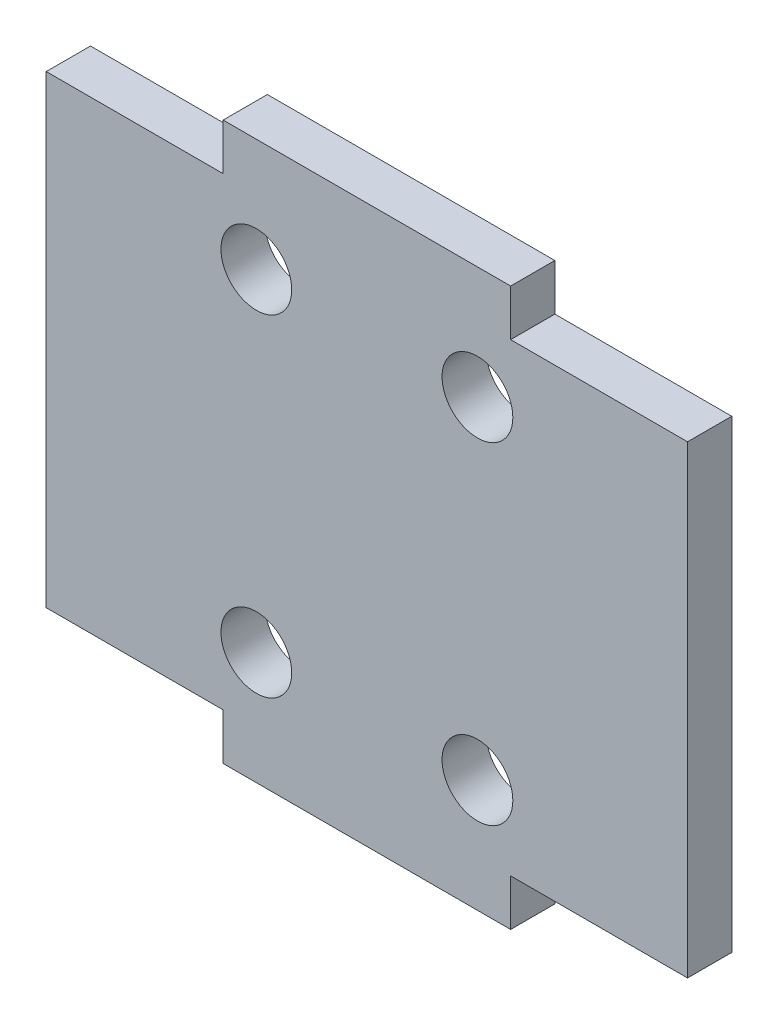
ISO-10303-21;
HEADER;
FILE_DESCRIPTION(('STEP AP214'),'2;1');
FILE_NAME('part.step','',(''),(''),'','','');
FILE_SCHEMA(('AUTOMOTIVE_DESIGN { 1 0 10303 214 1 1 1 1 }'));
ENDSEC;
DATA;
#1=APPLICATION_CONTEXT('core data for automotive mechanical design processes');
#2=APPLICATION_PROTOCOL_DEFINITION('international standard','automotive_design',2000,#1);
#3=PRODUCT_CONTEXT('',#1,'mechanical');
#4=PRODUCT('Part','Part','',(#3));
#5=PRODUCT_RELATED_PRODUCT_CATEGORY('part','',(#4));
#6=PRODUCT_DEFINITION_FORMATION('','',#4);
#7=PRODUCT_DEFINITION_CONTEXT('part definition',#1,'design');
#8=PRODUCT_DEFINITION('design','',#6,#7);
#9=PRODUCT_DEFINITION_SHAPE('','',#8);
#10=(LENGTH_UNIT() NAMED_UNIT(*) SI_UNIT(.MILLI.,.METRE.));
#11=(NAMED_UNIT(*) PLANE_ANGLE_UNIT() SI_UNIT($,.RADIAN.));
#12=(NAMED_UNIT(*) SI_UNIT($,.STERADIAN.) SOLID_ANGLE_UNIT());
#13=UNCERTAINTY_MEASURE_WITH_UNIT(LENGTH_MEASURE(1.E-05),#10,'distance_accuracy_value','');
#14=(GEOMETRIC_REPRESENTATION_CONTEXT(3) GLOBAL_UNCERTAINTY_ASSIGNED_CONTEXT((#13)) GLOBAL_UNIT_ASSIGNED_CONTEXT((#10,
#11,#12)) REPRESENTATION_CONTEXT('',''));
#15=CARTESIAN_POINT('',(0.,0.,0.));
#16=DIRECTION('',(0.,0.,1.));
#17=DIRECTION('',(1.,0.,0.));
#18=AXIS2_PLACEMENT_3D('',#15,#16,#17);
#19=CARTESIAN_POINT('',(0.,21.,2.));
#20=DIRECTION('',(0.,-1.,0.));
#21=DIRECTION('',(1.,0.,0.));
#22=AXIS2_PLACEMENT_3D('',#19,#20,#21);
#23=PLANE('',#22);
#24=DIRECTION('',(-1.,0.,0.));
#25=VECTOR('',#24,1.);
#26=CARTESIAN_POINT('',(0.,21.,0.));
#27=LINE('',#26,#25);
#28=CARTESIAN_POINT('',(29.,21.,0.));
#29=VERTEX_POINT('',#28);
#30=CARTESIAN_POINT('',(21.,21.,0.));
#31=VERTEX_POINT('',#30);
#32=EDGE_CURVE('E191',#29,#31,#27,.T.);
#33=ORIENTED_EDGE('',*,*,#32,.T.);
#34=DIRECTION('',(0.,0.,-1.));
#35=VECTOR('',#34,1.);
#36=CARTESIAN_POINT('',(21.,21.,2.));
#37=LINE('',#36,#35);
#38=CARTESIAN_POINT('',(21.,21.,2.));
#39=VERTEX_POINT('',#38);
#40=EDGE_CURVE('E11',#39,#31,#37,.T.);
#41=ORIENTED_EDGE('',*,*,#40,.F.);
#42=DIRECTION('',(-1.,0.,0.));
#43=VECTOR('',#42,1.);
#44=CARTESIAN_POINT('',(0.,21.,2.));
#45=LINE('',#44,#43);
#46=CARTESIAN_POINT('',(29.,21.,2.));
#47=VERTEX_POINT('',#46);
#48=EDGE_CURVE('E289',#47,#39,#45,.T.);
#49=ORIENTED_EDGE('',*,*,#48,.F.);
#50=DIRECTION('',(0.,0.,-1.));
#51=VECTOR('',#50,1.);
#52=CARTESIAN_POINT('',(29.,21.,2.));
#53=LINE('',#52,#51);
#54=EDGE_CURVE('E182',#47,#29,#53,.T.);
#55=ORIENTED_EDGE('',*,*,#54,.T.);
#56=EDGE_LOOP('',(#33,#41,#49,#55));
#57=FACE_BOUND('',#56,.T.);
#58=ADVANCED_FACE('F45',(#57),#23,.F.);
#59=CARTESIAN_POINT('',(21.,0.,2.));
#60=DIRECTION('',(-1.,0.,0.));
#61=DIRECTION('',(0.,-1.,0.));
#62=AXIS2_PLACEMENT_3D('',#59,#60,#61);
#63=PLANE('',#62);
#64=DIRECTION('',(0.,1.,0.));
#65=VECTOR('',#64,1.);
#66=CARTESIAN_POINT('',(21.,0.,0.));
#67=LINE('',#66,#65);
#68=CARTESIAN_POINT('',(21.,23.1,0.));
#69=VERTEX_POINT('',#68);
#70=EDGE_CURVE('E195',#31,#69,#67,.T.);
#71=ORIENTED_EDGE('',*,*,#70,.T.);
#72=DIRECTION('',(0.,0.,-1.));
#73=VECTOR('',#72,1.);
#74=CARTESIAN_POINT('',(21.,23.1,2.));
#75=LINE('',#74,#73);
#76=CARTESIAN_POINT('',(21.,23.1,2.));
#77=VERTEX_POINT('',#76);
#78=EDGE_CURVE('E55',#77,#69,#75,.T.);
#79=ORIENTED_EDGE('',*,*,#78,.F.);
#80=DIRECTION('',(0.,1.,0.));
#81=VECTOR('',#80,1.);
#82=CARTESIAN_POINT('',(21.,0.,2.));
#83=LINE('',#82,#81);
#84=EDGE_CURVE('E117',#39,#77,#83,.T.);
#85=ORIENTED_EDGE('',*,*,#84,.F.);
#86=ORIENTED_EDGE('',*,*,#40,.T.);
#87=EDGE_LOOP('',(#71,#79,#85,#86));
#88=FACE_BOUND('',#87,.T.);
#89=ADVANCED_FACE('F268',(#88),#63,.F.);
#90=CARTESIAN_POINT('',(0.,23.1,2.));
#91=DIRECTION('',(0.,1.,0.));
#92=DIRECTION('',(0.,0.,1.));
#93=AXIS2_PLACEMENT_3D('',#90,#91,#92);
#94=PLANE('',#93);
#95=DIRECTION('',(1.,0.,0.));
#96=VECTOR('',#95,1.);
#97=CARTESIAN_POINT('',(0.,23.1,0.));
#98=LINE('',#97,#96);
#99=CARTESIAN_POINT('',(7.99999999999999,23.1,0.));
#100=VERTEX_POINT('',#99);
#101=EDGE_CURVE('E200',#100,#69,#98,.T.);
#102=ORIENTED_EDGE('',*,*,#101,.F.);
#103=DIRECTION('',(0.,0.,-1.));
#104=VECTOR('',#103,1.);
#105=CARTESIAN_POINT('',(7.99999999999999,23.1,2.));
#106=LINE('',#105,#104);
#107=CARTESIAN_POINT('',(7.99999999999999,23.1,2.));
#108=VERTEX_POINT('',#107);
#109=EDGE_CURVE('E259',#108,#100,#106,.T.);
#110=ORIENTED_EDGE('',*,*,#109,.F.);
#111=DIRECTION('',(1.,0.,0.));
#112=VECTOR('',#111,1.);
#113=CARTESIAN_POINT('',(0.,23.1,2.));
#114=LINE('',#113,#112);
#115=EDGE_CURVE('E267',#108,#77,#114,.T.);
#116=ORIENTED_EDGE('',*,*,#115,.T.);
#117=ORIENTED_EDGE('',*,*,#78,.T.);
#118=EDGE_LOOP('',(#102,#110,#116,#117));
#119=FACE_BOUND('',#118,.T.);
#120=ADVANCED_FACE('F265',(#119),#94,.T.);
#121=CARTESIAN_POINT('',(8.00000000000007,0.,2.));
#122=DIRECTION('',(-1.,0.,0.));
#123=DIRECTION('',(0.,-1.,0.));
#124=AXIS2_PLACEMENT_3D('',#121,#122,#123);
#125=PLANE('',#124);
#126=DIRECTION('',(0.,1.,0.));
#127=VECTOR('',#126,1.);
#128=CARTESIAN_POINT('',(8.00000000000007,0.,0.));
#129=LINE('',#128,#127);
#130=CARTESIAN_POINT('',(8.,21.,0.));
#131=VERTEX_POINT('',#130);
#132=EDGE_CURVE('E204',#131,#100,#129,.T.);
#133=ORIENTED_EDGE('',*,*,#132,.F.);
#134=DIRECTION('',(0.,0.,-1.));
#135=VECTOR('',#134,1.);
#136=CARTESIAN_POINT('',(8.,21.,2.));
#137=LINE('',#136,#135);
#138=CARTESIAN_POINT('',(8.,21.,2.));
#139=VERTEX_POINT('',#138);
#140=EDGE_CURVE('E256',#139,#131,#137,.T.);
#141=ORIENTED_EDGE('',*,*,#140,.F.);
#142=DIRECTION('',(0.,1.,0.));
#143=VECTOR('',#142,1.);
#144=CARTESIAN_POINT('',(8.00000000000007,0.,2.));
#145=LINE('',#144,#143);
#146=EDGE_CURVE('E282',#139,#108,#145,.T.);
#147=ORIENTED_EDGE('',*,*,#146,.T.);
#148=ORIENTED_EDGE('',*,*,#109,.T.);
#149=EDGE_LOOP('',(#133,#141,#147,#148));
#150=FACE_BOUND('',#149,.T.);
#151=ADVANCED_FACE('F278',(#150),#125,.T.);
#152=CARTESIAN_POINT('',(0.,21.,0.));
#153=VERTEX_POINT('',#152);
#154=EDGE_CURVE('E196',#131,#153,#27,.T.);
#155=ORIENTED_EDGE('',*,*,#154,.T.);
#156=DIRECTION('',(0.,0.,-1.));
#157=VECTOR('',#156,1.);
#158=CARTESIAN_POINT('',(0.,21.,2.));
#159=LINE('',#158,#157);
#160=CARTESIAN_POINT('',(0.,21.,2.));
#161=VERTEX_POINT('',#160);
#162=EDGE_CURVE('E252',#161,#153,#159,.T.);
#163=ORIENTED_EDGE('',*,*,#162,.F.);
#164=EDGE_CURVE('E287',#139,#161,#45,.T.);
#165=ORIENTED_EDGE('',*,*,#164,.F.);
#166=ORIENTED_EDGE('',*,*,#140,.T.);
#167=EDGE_LOOP('',(#155,#163,#165,#166));
#168=FACE_BOUND('',#167,.T.);
#169=ADVANCED_FACE('F311',(#168),#23,.F.);
#170=CARTESIAN_POINT('',(0.,0.,2.));
#171=DIRECTION('',(1.,0.,0.));
#172=DIRECTION('',(0.,0.,-1.));
#173=AXIS2_PLACEMENT_3D('',#170,#171,#172);
#174=PLANE('',#173);
#175=DIRECTION('',(0.,-1.,0.));
#176=VECTOR('',#175,1.);
#177=CARTESIAN_POINT('',(0.,0.,0.));
#178=LINE('',#177,#176);
#179=CARTESIAN_POINT('',(0.,0.,0.));
#180=VERTEX_POINT('',#179);
#181=EDGE_CURVE('E208',#153,#180,#178,.T.);
#182=ORIENTED_EDGE('',*,*,#181,.T.);
#183=DIRECTION('',(0.,0.,-1.));
#184=VECTOR('',#183,1.);
#185=CARTESIAN_POINT('',(0.,0.,2.));
#186=LINE('',#185,#184);
#187=CARTESIAN_POINT('',(0.,0.,2.));
#188=VERTEX_POINT('',#187);
#189=EDGE_CURVE('E248',#188,#180,#186,.T.);
#190=ORIENTED_EDGE('',*,*,#189,.F.);
#191=DIRECTION('',(0.,-1.,0.));
#192=VECTOR('',#191,1.);
#193=CARTESIAN_POINT('',(0.,0.,2.));
#194=LINE('',#193,#192);
#195=EDGE_CURVE('E293',#161,#188,#194,.T.);
#196=ORIENTED_EDGE('',*,*,#195,.F.);
#197=ORIENTED_EDGE('',*,*,#162,.T.);
#198=EDGE_LOOP('',(#182,#190,#196,#197));
#199=FACE_BOUND('',#198,.T.);
#200=ADVANCED_FACE('F314',(#199),#174,.F.);
#201=CARTESIAN_POINT('',(0.,0.,2.));
#202=DIRECTION('',(0.,1.,0.));
#203=DIRECTION('',(0.,0.,1.));
#204=AXIS2_PLACEMENT_3D('',#201,#202,#203);
#205=PLANE('',#204);
#206=DIRECTION('',(1.,0.,0.));
#207=VECTOR('',#206,1.);
#208=CARTESIAN_POINT('',(0.,0.,0.));
#209=LINE('',#208,#207);
#210=CARTESIAN_POINT('',(8.,0.,0.));
#211=VERTEX_POINT('',#210);
#212=EDGE_CURVE('E211',#180,#211,#209,.T.);
#213=ORIENTED_EDGE('',*,*,#212,.T.);
#214=DIRECTION('',(0.,0.,-1.));
#215=VECTOR('',#214,1.);
#216=CARTESIAN_POINT('',(8.,0.,2.));
#217=LINE('',#216,#215);
#218=CARTESIAN_POINT('',(8.,0.,2.));
#219=VERTEX_POINT('',#218);
#220=EDGE_CURVE('E244',#219,#211,#217,.T.);
#221=ORIENTED_EDGE('',*,*,#220,.F.);
#222=DIRECTION('',(1.,0.,0.));
#223=VECTOR('',#222,1.);
#224=CARTESIAN_POINT('',(0.,0.,2.));
#225=LINE('',#224,#223);
#226=EDGE_CURVE('E159',#188,#219,#225,.T.);
#227=ORIENTED_EDGE('',*,*,#226,.F.);
#228=ORIENTED_EDGE('',*,*,#189,.T.);
#229=EDGE_LOOP('',(#213,#221,#227,#228));
#230=FACE_BOUND('',#229,.T.);
#231=ADVANCED_FACE('F318',(#230),#205,.F.);
#232=CARTESIAN_POINT('',(8.,0.,2.));
#233=DIRECTION('',(1.,0.,0.));
#234=DIRECTION('',(0.,0.,-1.));
#235=AXIS2_PLACEMENT_3D('',#232,#233,#234);
#236=PLANE('',#235);
#237=DIRECTION('',(0.,-1.,0.));
#238=VECTOR('',#237,1.);
#239=CARTESIAN_POINT('',(8.,0.,0.));
#240=LINE('',#239,#238);
#241=CARTESIAN_POINT('',(8.,-2.1,0.));
#242=VERTEX_POINT('',#241);
#243=EDGE_CURVE('E214',#211,#242,#240,.T.);
#244=ORIENTED_EDGE('',*,*,#243,.T.);
#245=DIRECTION('',(0.,0.,-1.));
#246=VECTOR('',#245,1.);
#247=CARTESIAN_POINT('',(8.,-2.1,2.));
#248=LINE('',#247,#246);
#249=CARTESIAN_POINT('',(8.,-2.1,2.));
#250=VERTEX_POINT('',#249);
#251=EDGE_CURVE('E240',#250,#242,#248,.T.);
#252=ORIENTED_EDGE('',*,*,#251,.F.);
#253=DIRECTION('',(0.,-1.,0.));
#254=VECTOR('',#253,1.);
#255=CARTESIAN_POINT('',(8.,0.,2.));
#256=LINE('',#255,#254);
#257=EDGE_CURVE('E168',#219,#250,#256,.T.);
#258=ORIENTED_EDGE('',*,*,#257,.F.);
#259=ORIENTED_EDGE('',*,*,#220,.T.);
#260=EDGE_LOOP('',(#244,#252,#258,#259));
#261=FACE_BOUND('',#260,.T.);
#262=ADVANCED_FACE('F302',(#261),#236,.F.);
#263=CARTESIAN_POINT('',(0.,-2.1,2.));
#264=DIRECTION('',(0.,1.,0.));
#265=DIRECTION('',(-1.,0.,0.));
#266=AXIS2_PLACEMENT_3D('',#263,#264,#265);
#267=PLANE('',#266);
#268=DIRECTION('',(1.,0.,0.));
#269=VECTOR('',#268,1.);
#270=CARTESIAN_POINT('',(0.,-2.1,0.));
#271=LINE('',#270,#269);
#272=CARTESIAN_POINT('',(21.,-2.1,0.));
#273=VERTEX_POINT('',#272);
#274=EDGE_CURVE('E217',#242,#273,#271,.T.);
#275=ORIENTED_EDGE('',*,*,#274,.T.);
#276=DIRECTION('',(0.,0.,-1.));
#277=VECTOR('',#276,1.);
#278=CARTESIAN_POINT('',(21.,-2.1,2.));
#279=LINE('',#278,#277);
#280=CARTESIAN_POINT('',(21.,-2.1,2.));
#281=VERTEX_POINT('',#280);
#282=EDGE_CURVE('E152',#281,#273,#279,.T.);
#283=ORIENTED_EDGE('',*,*,#282,.F.);
#284=DIRECTION('',(1.,0.,0.));
#285=VECTOR('',#284,1.);
#286=CARTESIAN_POINT('',(0.,-2.1,2.));
#287=LINE('',#286,#285);
#288=EDGE_CURVE('E163',#250,#281,#287,.T.);
#289=ORIENTED_EDGE('',*,*,#288,.F.);
#290=ORIENTED_EDGE('',*,*,#251,.T.);
#291=EDGE_LOOP('',(#275,#283,#289,#290));
#292=FACE_BOUND('',#291,.T.);
#293=ADVANCED_FACE('F306',(#292),#267,.F.);
#294=CARTESIAN_POINT('',(21.,0.,2.));
#295=DIRECTION('',(1.,0.,0.));
#296=DIRECTION('',(0.,1.,0.));
#297=AXIS2_PLACEMENT_3D('',#294,#295,#296);
#298=PLANE('',#297);
#299=DIRECTION('',(0.,-1.,0.));
#300=VECTOR('',#299,1.);
#301=CARTESIAN_POINT('',(21.,0.,0.));
#302=LINE('',#301,#300);
#303=CARTESIAN_POINT('',(21.,0.,0.));
#304=VERTEX_POINT('',#303);
#305=EDGE_CURVE('E150',#304,#273,#302,.T.);
#306=ORIENTED_EDGE('',*,*,#305,.F.);
#307=DIRECTION('',(0.,0.,-1.));
#308=VECTOR('',#307,1.);
#309=CARTESIAN_POINT('',(21.,0.,2.));
#310=LINE('',#309,#308);
#311=CARTESIAN_POINT('',(21.,0.,2.));
#312=VERTEX_POINT('',#311);
#313=EDGE_CURVE('E144',#312,#304,#310,.T.);
#314=ORIENTED_EDGE('',*,*,#313,.F.);
#315=DIRECTION('',(0.,-1.,0.));
#316=VECTOR('',#315,1.);
#317=CARTESIAN_POINT('',(21.,0.,2.));
#318=LINE('',#317,#316);
#319=EDGE_CURVE('E148',#312,#281,#318,.T.);
#320=ORIENTED_EDGE('',*,*,#319,.T.);
#321=ORIENTED_EDGE('',*,*,#282,.T.);
#322=EDGE_LOOP('',(#306,#314,#320,#321));
#323=FACE_BOUND('',#322,.T.);
#324=ADVANCED_FACE('F146',(#323),#298,.T.);
#325=CARTESIAN_POINT('',(29.,0.,0.));
#326=VERTEX_POINT('',#325);
#327=EDGE_CURVE('E103',#304,#326,#209,.T.);
#328=ORIENTED_EDGE('',*,*,#327,.T.);
#329=DIRECTION('',(0.,0.,-1.));
#330=VECTOR('',#329,1.);
#331=CARTESIAN_POINT('',(29.,0.,2.));
#332=LINE('',#331,#330);
#333=CARTESIAN_POINT('',(29.,0.,2.));
#334=VERTEX_POINT('',#333);
#335=EDGE_CURVE('E153',#334,#326,#332,.T.);
#336=ORIENTED_EDGE('',*,*,#335,.F.);
#337=EDGE_CURVE('E155',#312,#334,#225,.T.);
#338=ORIENTED_EDGE('',*,*,#337,.F.);
#339=ORIENTED_EDGE('',*,*,#313,.T.);
#340=EDGE_LOOP('',(#328,#336,#338,#339));
#341=FACE_BOUND('',#340,.T.);
#342=ADVANCED_FACE('F156',(#341),#205,.F.);
#343=CARTESIAN_POINT('',(9.5,3.00000000000001,2.));
#344=DIRECTION('',(0.,0.,-1.));
#345=DIRECTION('',(-1.,0.,0.));
#346=AXIS2_PLACEMENT_3D('',#343,#344,#345);
#347=CYLINDRICAL_SURFACE('',#346,1.6);
#348=CARTESIAN_POINT('',(9.5,3.00000000000001,2.));
#349=DIRECTION('',(0.,0.,1.));
#350=DIRECTION('',(1.,0.,0.));
#351=AXIS2_PLACEMENT_3D('',#348,#349,#350);
#352=CIRCLE('',#351,1.6);
#353=CARTESIAN_POINT('',(11.1,3.00000000000001,2.));
#354=VERTEX_POINT('',#353);
#355=EDGE_CURVE('E174',#354,#354,#352,.T.);
#356=ORIENTED_EDGE('',*,*,#355,.T.);
#357=EDGE_LOOP('',(#356));
#358=FACE_BOUND('',#357,.T.);
#359=CARTESIAN_POINT('',(9.5,3.00000000000001,0.));
#360=DIRECTION('',(0.,0.,1.));
#361=DIRECTION('',(1.,0.,0.));
#362=AXIS2_PLACEMENT_3D('',#359,#360,#361);
#363=CIRCLE('',#362,1.6);
#364=CARTESIAN_POINT('',(11.1,3.00000000000001,0.));
#365=VERTEX_POINT('',#364);
#366=EDGE_CURVE('E225',#365,#365,#363,.T.);
#367=ORIENTED_EDGE('',*,*,#366,.F.);
#368=EDGE_LOOP('',(#367));
#369=FACE_BOUND('',#368,.T.);
#370=ADVANCED_FACE('F330',(#358,#369),#347,.F.);
#371=CARTESIAN_POINT('',(29.,0.,2.));
#372=DIRECTION('',(-1.,0.,0.));
#373=DIRECTION('',(0.,0.,1.));
#374=AXIS2_PLACEMENT_3D('',#371,#372,#373);
#375=PLANE('',#374);
#376=DIRECTION('',(0.,1.,0.));
#377=VECTOR('',#376,1.);
#378=CARTESIAN_POINT('',(29.,0.,0.));
#379=LINE('',#378,#377);
#380=EDGE_CURVE('E109',#326,#29,#379,.T.);
#381=ORIENTED_EDGE('',*,*,#380,.T.);
#382=ORIENTED_EDGE('',*,*,#54,.F.);
#383=DIRECTION('',(0.,1.,0.));
#384=VECTOR('',#383,1.);
#385=CARTESIAN_POINT('',(29.,0.,2.));
#386=LINE('',#385,#384);
#387=EDGE_CURVE('E63',#334,#47,#386,.T.);
#388=ORIENTED_EDGE('',*,*,#387,.F.);
#389=ORIENTED_EDGE('',*,*,#335,.T.);
#390=EDGE_LOOP('',(#381,#382,#388,#389));
#391=FACE_BOUND('',#390,.T.);
#392=ADVANCED_FACE('F349',(#391),#375,.F.);
#393=CARTESIAN_POINT('',(19.5,18.,2.));
#394=DIRECTION('',(0.,0.,-1.));
#395=DIRECTION('',(-1.,0.,0.));
#396=AXIS2_PLACEMENT_3D('',#393,#394,#395);
#397=CYLINDRICAL_SURFACE('',#396,1.6);
#398=CARTESIAN_POINT('',(19.5,18.,2.));
#399=DIRECTION('',(0.,0.,1.));
#400=DIRECTION('',(1.,0.,0.));
#401=AXIS2_PLACEMENT_3D('',#398,#399,#400);
#402=CIRCLE('',#401,1.6);
#403=CARTESIAN_POINT('',(21.1,18.,2.));
#404=VERTEX_POINT('',#403);
#405=EDGE_CURVE('E360',#404,#404,#402,.T.);
#406=ORIENTED_EDGE('',*,*,#405,.T.);
#407=EDGE_LOOP('',(#406));
#408=FACE_BOUND('',#407,.T.);
#409=CARTESIAN_POINT('',(19.5,18.,0.));
#410=DIRECTION('',(0.,0.,1.));
#411=DIRECTION('',(1.,0.,0.));
#412=AXIS2_PLACEMENT_3D('',#409,#410,#411);
#413=CIRCLE('',#412,1.6);
#414=CARTESIAN_POINT('',(21.1,18.,0.));
#415=VERTEX_POINT('',#414);
#416=EDGE_CURVE('E187',#415,#415,#413,.T.);
#417=ORIENTED_EDGE('',*,*,#416,.F.);
#418=EDGE_LOOP('',(#417));
#419=FACE_BOUND('',#418,.T.);
#420=ADVANCED_FACE('F347',(#408,#419),#397,.F.);
#421=CARTESIAN_POINT('',(9.5,18.,2.));
#422=DIRECTION('',(0.,0.,-1.));
#423=DIRECTION('',(-1.,0.,0.));
#424=AXIS2_PLACEMENT_3D('',#421,#422,#423);
#425=CYLINDRICAL_SURFACE('',#424,1.6);
#426=CARTESIAN_POINT('',(9.5,18.,2.));
#427=DIRECTION('',(0.,0.,1.));
#428=DIRECTION('',(1.,0.,0.));
#429=AXIS2_PLACEMENT_3D('',#426,#427,#428);
#430=CIRCLE('',#429,1.6);
#431=CARTESIAN_POINT('',(11.1,18.,2.));
#432=VERTEX_POINT('',#431);
#433=EDGE_CURVE('E233',#432,#432,#430,.F.);
#434=ORIENTED_EDGE('',*,*,#433,.F.);
#435=EDGE_LOOP('',(#434));
#436=FACE_BOUND('',#435,.T.);
#437=CARTESIAN_POINT('',(9.5,18.,0.));
#438=DIRECTION('',(0.,0.,1.));
#439=DIRECTION('',(1.,0.,0.));
#440=AXIS2_PLACEMENT_3D('',#437,#438,#439);
#441=CIRCLE('',#440,1.6);
#442=CARTESIAN_POINT('',(11.1,18.,0.));
#443=VERTEX_POINT('',#442);
#444=EDGE_CURVE('E183',#443,#443,#441,.F.);
#445=ORIENTED_EDGE('',*,*,#444,.T.);
#446=EDGE_LOOP('',(#445));
#447=FACE_BOUND('',#446,.T.);
#448=ADVANCED_FACE('F47',(#436,#447),#425,.F.);
#449=CARTESIAN_POINT('',(19.5,3.00000000000001,2.));
#450=DIRECTION('',(0.,0.,-1.));
#451=DIRECTION('',(-1.,0.,0.));
#452=AXIS2_PLACEMENT_3D('',#449,#450,#451);
#453=CYLINDRICAL_SURFACE('',#452,1.6);
#454=CARTESIAN_POINT('',(19.5,3.00000000000001,2.));
#455=DIRECTION('',(0.,0.,1.));
#456=DIRECTION('',(1.,0.,0.));
#457=AXIS2_PLACEMENT_3D('',#454,#455,#456);
#458=CIRCLE('',#457,1.6);
#459=CARTESIAN_POINT('',(21.1,3.00000000000001,2.));
#460=VERTEX_POINT('',#459);
#461=EDGE_CURVE('E178',#460,#460,#458,.F.);
#462=ORIENTED_EDGE('',*,*,#461,.F.);
#463=EDGE_LOOP('',(#462));
#464=FACE_BOUND('',#463,.T.);
#465=CARTESIAN_POINT('',(19.5,3.00000000000001,0.));
#466=DIRECTION('',(0.,0.,1.));
#467=DIRECTION('',(1.,0.,0.));
#468=AXIS2_PLACEMENT_3D('',#465,#466,#467);
#469=CIRCLE('',#468,1.6);
#470=CARTESIAN_POINT('',(21.1,3.00000000000001,0.));
#471=VERTEX_POINT('',#470);
#472=EDGE_CURVE('E229',#471,#471,#469,.F.);
#473=ORIENTED_EDGE('',*,*,#472,.T.);
#474=EDGE_LOOP('',(#473));
#475=FACE_BOUND('',#474,.T.);
#476=ADVANCED_FACE('F355',(#464,#475),#453,.F.);
#477=CARTESIAN_POINT('',(0.,0.,2.));
#478=DIRECTION('',(0.,0.,1.));
#479=DIRECTION('',(1.,0.,0.));
#480=AXIS2_PLACEMENT_3D('',#477,#478,#479);
#481=PLANE('',#480);
#482=ORIENTED_EDGE('',*,*,#433,.T.);
#483=EDGE_LOOP('',(#482));
#484=FACE_BOUND('',#483,.T.);
#485=ORIENTED_EDGE('',*,*,#405,.F.);
#486=EDGE_LOOP('',(#485));
#487=FACE_BOUND('',#486,.T.);
#488=ORIENTED_EDGE('',*,*,#48,.T.);
#489=ORIENTED_EDGE('',*,*,#84,.T.);
#490=ORIENTED_EDGE('',*,*,#115,.F.);
#491=ORIENTED_EDGE('',*,*,#146,.F.);
#492=ORIENTED_EDGE('',*,*,#164,.T.);
#493=ORIENTED_EDGE('',*,*,#195,.T.);
#494=ORIENTED_EDGE('',*,*,#226,.T.);
#495=ORIENTED_EDGE('',*,*,#257,.T.);
#496=ORIENTED_EDGE('',*,*,#288,.T.);
#497=ORIENTED_EDGE('',*,*,#319,.F.);
#498=ORIENTED_EDGE('',*,*,#337,.T.);
#499=ORIENTED_EDGE('',*,*,#387,.T.);
#500=EDGE_LOOP('',(#488,#489,#490,#491,#492,#493,#494,#495,#496,#497,#498,#499));
#501=FACE_BOUND('',#500,.T.);
#502=ORIENTED_EDGE('',*,*,#355,.F.);
#503=EDGE_LOOP('',(#502));
#504=FACE_BOUND('',#503,.T.);
#505=ORIENTED_EDGE('',*,*,#461,.T.);
#506=EDGE_LOOP('',(#505));
#507=FACE_BOUND('',#506,.T.);
#508=ADVANCED_FACE('F160',(#484,#487,#501,#504,#507),#481,.T.);
#509=CARTESIAN_POINT('',(0.,0.,0.));
#510=DIRECTION('',(0.,0.,1.));
#511=DIRECTION('',(1.,0.,0.));
#512=AXIS2_PLACEMENT_3D('',#509,#510,#511);
#513=PLANE('',#512);
#514=ORIENTED_EDGE('',*,*,#444,.F.);
#515=EDGE_LOOP('',(#514));
#516=FACE_BOUND('',#515,.T.);
#517=ORIENTED_EDGE('',*,*,#416,.T.);
#518=EDGE_LOOP('',(#517));
#519=FACE_BOUND('',#518,.T.);
#520=ORIENTED_EDGE('',*,*,#32,.F.);
#521=ORIENTED_EDGE('',*,*,#380,.F.);
#522=ORIENTED_EDGE('',*,*,#327,.F.);
#523=ORIENTED_EDGE('',*,*,#305,.T.);
#524=ORIENTED_EDGE('',*,*,#274,.F.);
#525=ORIENTED_EDGE('',*,*,#243,.F.);
#526=ORIENTED_EDGE('',*,*,#212,.F.);
#527=ORIENTED_EDGE('',*,*,#181,.F.);
#528=ORIENTED_EDGE('',*,*,#154,.F.);
#529=ORIENTED_EDGE('',*,*,#132,.T.);
#530=ORIENTED_EDGE('',*,*,#101,.T.);
#531=ORIENTED_EDGE('',*,*,#70,.F.);
#532=EDGE_LOOP('',(#520,#521,#522,#523,#524,#525,#526,#527,#528,#529,#530,#531));
#533=FACE_BOUND('',#532,.T.);
#534=ORIENTED_EDGE('',*,*,#366,.T.);
#535=EDGE_LOOP('',(#534));
#536=FACE_BOUND('',#535,.T.);
#537=ORIENTED_EDGE('',*,*,#472,.F.);
#538=EDGE_LOOP('',(#537));
#539=FACE_BOUND('',#538,.T.);
#540=ADVANCED_FACE('F272',(#516,#519,#533,#536,#539),#513,.F.);
#541=CLOSED_SHELL('',(#58,#89,#120,#151,#169,#200,#231,#262,#293,#324,#342,#370,#392,#420,#448,
#476,#508,#540));
#542=MANIFOLD_SOLID_BREP('B2',#541);
#543=ADVANCED_BREP_SHAPE_REPRESENTATION('',(#18,#542),#14);
#544=SHAPE_DEFINITION_REPRESENTATION(#9,#543);
ENDSEC;
END-ISO-10303-21;
